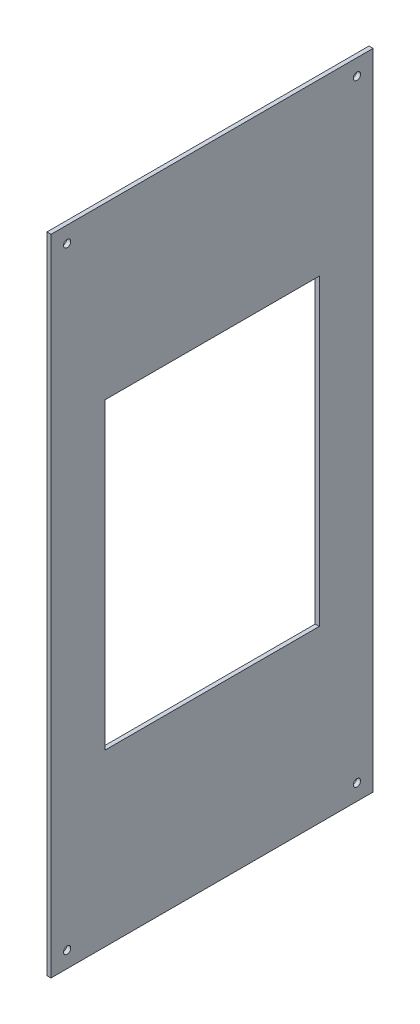
ISO-10303-21;
HEADER;
FILE_DESCRIPTION(('STEP AP214'),'2;1');
FILE_NAME('part.step','',(''),(''),'','','');
FILE_SCHEMA(('AUTOMOTIVE_DESIGN { 1 0 10303 214 1 1 1 1 }'));
ENDSEC;
DATA;
#1=APPLICATION_CONTEXT('core data for automotive mechanical design processes');
#2=APPLICATION_PROTOCOL_DEFINITION('international standard','automotive_design',2000,#1);
#3=PRODUCT_CONTEXT('',#1,'mechanical');
#4=PRODUCT('Part','Part','',(#3));
#5=PRODUCT_RELATED_PRODUCT_CATEGORY('part','',(#4));
#6=PRODUCT_DEFINITION_FORMATION('','',#4);
#7=PRODUCT_DEFINITION_CONTEXT('part definition',#1,'design');
#8=PRODUCT_DEFINITION('design','',#6,#7);
#9=PRODUCT_DEFINITION_SHAPE('','',#8);
#10=(LENGTH_UNIT() NAMED_UNIT(*) SI_UNIT(.MILLI.,.METRE.));
#11=(NAMED_UNIT(*) PLANE_ANGLE_UNIT() SI_UNIT($,.RADIAN.));
#12=(NAMED_UNIT(*) SI_UNIT($,.STERADIAN.) SOLID_ANGLE_UNIT());
#13=UNCERTAINTY_MEASURE_WITH_UNIT(LENGTH_MEASURE(1.E-05),#10,'distance_accuracy_value','');
#14=(GEOMETRIC_REPRESENTATION_CONTEXT(3) GLOBAL_UNCERTAINTY_ASSIGNED_CONTEXT((#13)) GLOBAL_UNIT_ASSIGNED_CONTEXT((#10,
#11,#12)) REPRESENTATION_CONTEXT('',''));
#15=CARTESIAN_POINT('',(0.,0.,0.));
#16=DIRECTION('',(0.,0.,1.));
#17=DIRECTION('',(1.,0.,0.));
#18=AXIS2_PLACEMENT_3D('',#15,#16,#17);
#19=CARTESIAN_POINT('',(3.175,0.,0.));
#20=DIRECTION('',(-1.,0.,0.));
#21=DIRECTION('',(0.,0.,1.));
#22=AXIS2_PLACEMENT_3D('',#19,#20,#21);
#23=PLANE('',#22);
#24=DIRECTION('',(0.,1.,0.));
#25=VECTOR('',#24,1.);
#26=CARTESIAN_POINT('',(3.175,117.75,-83.25));
#27=LINE('',#26,#25);
#28=CARTESIAN_POINT('',(3.175,-117.75,-83.25));
#29=VERTEX_POINT('',#28);
#30=CARTESIAN_POINT('',(3.175,117.75,-83.25));
#31=VERTEX_POINT('',#30);
#32=EDGE_CURVE('E144',#29,#31,#27,.T.);
#33=ORIENTED_EDGE('',*,*,#32,.F.);
#34=DIRECTION('',(0.,0.,-1.));
#35=VECTOR('',#34,1.);
#36=CARTESIAN_POINT('',(3.175,-117.75,-83.25));
#37=LINE('',#36,#35);
#38=CARTESIAN_POINT('',(3.175,-117.75,83.25));
#39=VERTEX_POINT('',#38);
#40=EDGE_CURVE('E60',#39,#29,#37,.T.);
#41=ORIENTED_EDGE('',*,*,#40,.F.);
#42=DIRECTION('',(0.,-1.,0.));
#43=VECTOR('',#42,1.);
#44=CARTESIAN_POINT('',(3.175,117.75,83.25));
#45=LINE('',#44,#43);
#46=CARTESIAN_POINT('',(3.175,117.75,83.25));
#47=VERTEX_POINT('',#46);
#48=EDGE_CURVE('E131',#47,#39,#45,.T.);
#49=ORIENTED_EDGE('',*,*,#48,.F.);
#50=DIRECTION('',(0.,0.,1.));
#51=VECTOR('',#50,1.);
#52=CARTESIAN_POINT('',(3.175,117.75,-83.25));
#53=LINE('',#52,#51);
#54=EDGE_CURVE('E135',#31,#47,#53,.T.);
#55=ORIENTED_EDGE('',*,*,#54,.F.);
#56=EDGE_LOOP('',(#33,#41,#49,#55));
#57=FACE_BOUND('',#56,.T.);
#58=DIRECTION('',(0.,0.,1.));
#59=VECTOR('',#58,1.);
#60=CARTESIAN_POINT('',(3.175,250.,-125.));
#61=LINE('',#60,#59);
#62=CARTESIAN_POINT('',(3.175,250.,-125.));
#63=VERTEX_POINT('',#62);
#64=CARTESIAN_POINT('',(3.175,250.,125.));
#65=VERTEX_POINT('',#64);
#66=EDGE_CURVE('E191',#63,#65,#61,.T.);
#67=ORIENTED_EDGE('',*,*,#66,.T.);
#68=DIRECTION('',(0.,-1.,0.));
#69=VECTOR('',#68,1.);
#70=CARTESIAN_POINT('',(3.175,-250.,125.));
#71=LINE('',#70,#69);
#72=CARTESIAN_POINT('',(3.175,-250.,125.));
#73=VERTEX_POINT('',#72);
#74=EDGE_CURVE('E195',#65,#73,#71,.T.);
#75=ORIENTED_EDGE('',*,*,#74,.T.);
#76=DIRECTION('',(0.,0.,-1.));
#77=VECTOR('',#76,1.);
#78=CARTESIAN_POINT('',(3.175,-250.,-125.));
#79=LINE('',#78,#77);
#80=CARTESIAN_POINT('',(3.175,-250.,-125.));
#81=VERTEX_POINT('',#80);
#82=EDGE_CURVE('E199',#73,#81,#79,.T.);
#83=ORIENTED_EDGE('',*,*,#82,.T.);
#84=DIRECTION('',(0.,1.,0.));
#85=VECTOR('',#84,1.);
#86=CARTESIAN_POINT('',(3.175,-250.,-125.));
#87=LINE('',#86,#85);
#88=EDGE_CURVE('E202',#81,#63,#87,.T.);
#89=ORIENTED_EDGE('',*,*,#88,.T.);
#90=EDGE_LOOP('',(#67,#75,#83,#89));
#91=FACE_BOUND('',#90,.T.);
#92=CARTESIAN_POINT('',(3.175,-237.5,112.5));
#93=DIRECTION('',(1.,0.,0.));
#94=DIRECTION('',(0.,0.,-1.));
#95=AXIS2_PLACEMENT_3D('',#92,#93,#94);
#96=CIRCLE('',#95,2.8);
#97=CARTESIAN_POINT('',(3.175,-237.5,109.7));
#98=VERTEX_POINT('',#97);
#99=EDGE_CURVE('E183',#98,#98,#96,.T.);
#100=ORIENTED_EDGE('',*,*,#99,.F.);
#101=EDGE_LOOP('',(#100));
#102=FACE_BOUND('',#101,.T.);
#103=CARTESIAN_POINT('',(3.175,237.5,112.5));
#104=DIRECTION('',(1.,0.,0.));
#105=DIRECTION('',(0.,0.,1.));
#106=AXIS2_PLACEMENT_3D('',#103,#104,#105);
#107=CIRCLE('',#106,2.8);
#108=CARTESIAN_POINT('',(3.175,237.5,115.3));
#109=VERTEX_POINT('',#108);
#110=EDGE_CURVE('E175',#109,#109,#107,.T.);
#111=ORIENTED_EDGE('',*,*,#110,.F.);
#112=EDGE_LOOP('',(#111));
#113=FACE_BOUND('',#112,.T.);
#114=CARTESIAN_POINT('',(3.175,237.5,-112.5));
#115=DIRECTION('',(1.,0.,0.));
#116=DIRECTION('',(0.,0.,-1.));
#117=AXIS2_PLACEMENT_3D('',#114,#115,#116);
#118=CIRCLE('',#117,2.8);
#119=CARTESIAN_POINT('',(3.175,237.5,-115.3));
#120=VERTEX_POINT('',#119);
#121=EDGE_CURVE('E167',#120,#120,#118,.T.);
#122=ORIENTED_EDGE('',*,*,#121,.F.);
#123=EDGE_LOOP('',(#122));
#124=FACE_BOUND('',#123,.T.);
#125=CARTESIAN_POINT('',(3.175,-237.5,-112.5));
#126=DIRECTION('',(1.,0.,0.));
#127=DIRECTION('',(0.,0.,1.));
#128=AXIS2_PLACEMENT_3D('',#125,#126,#127);
#129=CIRCLE('',#128,2.8);
#130=CARTESIAN_POINT('',(3.175,-237.5,-109.7));
#131=VERTEX_POINT('',#130);
#132=EDGE_CURVE('E159',#131,#131,#129,.T.);
#133=ORIENTED_EDGE('',*,*,#132,.F.);
#134=EDGE_LOOP('',(#133));
#135=FACE_BOUND('',#134,.T.);
#136=ADVANCED_FACE('F44',(#57,#91,#102,#113,#124,#135),#23,.F.);
#137=CARTESIAN_POINT('',(0.,0.,0.));
#138=DIRECTION('',(-1.,0.,0.));
#139=DIRECTION('',(0.,0.,1.));
#140=AXIS2_PLACEMENT_3D('',#137,#138,#139);
#141=PLANE('',#140);
#142=DIRECTION('',(0.,0.,-1.));
#143=VECTOR('',#142,1.);
#144=CARTESIAN_POINT('',(0.,-117.75,-83.25));
#145=LINE('',#144,#143);
#146=CARTESIAN_POINT('',(0.,-117.75,83.25));
#147=VERTEX_POINT('',#146);
#148=CARTESIAN_POINT('',(0.,-117.75,-83.25));
#149=VERTEX_POINT('',#148);
#150=EDGE_CURVE('E112',#147,#149,#145,.T.);
#151=ORIENTED_EDGE('',*,*,#150,.T.);
#152=DIRECTION('',(0.,1.,0.));
#153=VECTOR('',#152,1.);
#154=CARTESIAN_POINT('',(0.,117.75,-83.25));
#155=LINE('',#154,#153);
#156=CARTESIAN_POINT('',(0.,117.75,-83.25));
#157=VERTEX_POINT('',#156);
#158=EDGE_CURVE('E122',#149,#157,#155,.T.);
#159=ORIENTED_EDGE('',*,*,#158,.T.);
#160=DIRECTION('',(0.,0.,1.));
#161=VECTOR('',#160,1.);
#162=CARTESIAN_POINT('',(0.,117.75,-83.25));
#163=LINE('',#162,#161);
#164=CARTESIAN_POINT('',(0.,117.75,83.25));
#165=VERTEX_POINT('',#164);
#166=EDGE_CURVE('E68',#157,#165,#163,.T.);
#167=ORIENTED_EDGE('',*,*,#166,.T.);
#168=DIRECTION('',(0.,-1.,0.));
#169=VECTOR('',#168,1.);
#170=CARTESIAN_POINT('',(0.,117.75,83.25));
#171=LINE('',#170,#169);
#172=EDGE_CURVE('E119',#165,#147,#171,.T.);
#173=ORIENTED_EDGE('',*,*,#172,.T.);
#174=EDGE_LOOP('',(#151,#159,#167,#173));
#175=FACE_BOUND('',#174,.T.);
#176=CARTESIAN_POINT('',(0.,237.5,-112.5));
#177=DIRECTION('',(1.,0.,0.));
#178=DIRECTION('',(0.,0.,-1.));
#179=AXIS2_PLACEMENT_3D('',#176,#177,#178);
#180=CIRCLE('',#179,2.8);
#181=CARTESIAN_POINT('',(0.,237.5,-115.3));
#182=VERTEX_POINT('',#181);
#183=EDGE_CURVE('E163',#182,#182,#180,.T.);
#184=ORIENTED_EDGE('',*,*,#183,.T.);
#185=EDGE_LOOP('',(#184));
#186=FACE_BOUND('',#185,.T.);
#187=CARTESIAN_POINT('',(0.,-237.5,112.5));
#188=DIRECTION('',(1.,0.,0.));
#189=DIRECTION('',(0.,0.,-1.));
#190=AXIS2_PLACEMENT_3D('',#187,#188,#189);
#191=CIRCLE('',#190,2.8);
#192=CARTESIAN_POINT('',(0.,-237.5,109.7));
#193=VERTEX_POINT('',#192);
#194=EDGE_CURVE('E179',#193,#193,#191,.T.);
#195=ORIENTED_EDGE('',*,*,#194,.T.);
#196=EDGE_LOOP('',(#195));
#197=FACE_BOUND('',#196,.T.);
#198=DIRECTION('',(0.,0.,1.));
#199=VECTOR('',#198,1.);
#200=CARTESIAN_POINT('',(0.,250.,-125.));
#201=LINE('',#200,#199);
#202=CARTESIAN_POINT('',(0.,250.,-125.));
#203=VERTEX_POINT('',#202);
#204=CARTESIAN_POINT('',(0.,250.,125.));
#205=VERTEX_POINT('',#204);
#206=EDGE_CURVE('E187',#203,#205,#201,.T.);
#207=ORIENTED_EDGE('',*,*,#206,.F.);
#208=DIRECTION('',(0.,1.,0.));
#209=VECTOR('',#208,1.);
#210=CARTESIAN_POINT('',(0.,-250.,-125.));
#211=LINE('',#210,#209);
#212=CARTESIAN_POINT('',(0.,-250.,-125.));
#213=VERTEX_POINT('',#212);
#214=EDGE_CURVE('E196',#213,#203,#211,.T.);
#215=ORIENTED_EDGE('',*,*,#214,.F.);
#216=DIRECTION('',(0.,0.,-1.));
#217=VECTOR('',#216,1.);
#218=CARTESIAN_POINT('',(0.,-250.,-125.));
#219=LINE('',#218,#217);
#220=CARTESIAN_POINT('',(0.,-250.,125.));
#221=VERTEX_POINT('',#220);
#222=EDGE_CURVE('E212',#221,#213,#219,.T.);
#223=ORIENTED_EDGE('',*,*,#222,.F.);
#224=DIRECTION('',(0.,-1.,0.));
#225=VECTOR('',#224,1.);
#226=CARTESIAN_POINT('',(0.,-250.,125.));
#227=LINE('',#226,#225);
#228=EDGE_CURVE('E209',#205,#221,#227,.T.);
#229=ORIENTED_EDGE('',*,*,#228,.F.);
#230=EDGE_LOOP('',(#207,#215,#223,#229));
#231=FACE_BOUND('',#230,.T.);
#232=CARTESIAN_POINT('',(0.,237.5,112.5));
#233=DIRECTION('',(1.,0.,0.));
#234=DIRECTION('',(0.,0.,1.));
#235=AXIS2_PLACEMENT_3D('',#232,#233,#234);
#236=CIRCLE('',#235,2.8);
#237=CARTESIAN_POINT('',(0.,237.5,115.3));
#238=VERTEX_POINT('',#237);
#239=EDGE_CURVE('E171',#238,#238,#236,.T.);
#240=ORIENTED_EDGE('',*,*,#239,.T.);
#241=EDGE_LOOP('',(#240));
#242=FACE_BOUND('',#241,.T.);
#243=CARTESIAN_POINT('',(0.,-237.5,-112.5));
#244=DIRECTION('',(1.,0.,0.));
#245=DIRECTION('',(0.,0.,1.));
#246=AXIS2_PLACEMENT_3D('',#243,#244,#245);
#247=CIRCLE('',#246,2.8);
#248=CARTESIAN_POINT('',(0.,-237.5,-109.7));
#249=VERTEX_POINT('',#248);
#250=EDGE_CURVE('E153',#249,#249,#247,.T.);
#251=ORIENTED_EDGE('',*,*,#250,.T.);
#252=EDGE_LOOP('',(#251));
#253=FACE_BOUND('',#252,.T.);
#254=ADVANCED_FACE('F127',(#175,#186,#197,#231,#242,#253),#141,.T.);
#255=CARTESIAN_POINT('',(3.175,250.,-125.));
#256=DIRECTION('',(0.,-1.,0.));
#257=DIRECTION('',(0.,0.,-1.));
#258=AXIS2_PLACEMENT_3D('',#255,#256,#257);
#259=PLANE('',#258);
#260=ORIENTED_EDGE('',*,*,#206,.T.);
#261=DIRECTION('',(-1.,0.,0.));
#262=VECTOR('',#261,1.);
#263=CARTESIAN_POINT('',(3.175,250.,125.));
#264=LINE('',#263,#262);
#265=EDGE_CURVE('E11',#65,#205,#264,.T.);
#266=ORIENTED_EDGE('',*,*,#265,.F.);
#267=ORIENTED_EDGE('',*,*,#66,.F.);
#268=DIRECTION('',(-1.,0.,0.));
#269=VECTOR('',#268,1.);
#270=CARTESIAN_POINT('',(3.175,250.,-125.));
#271=LINE('',#270,#269);
#272=EDGE_CURVE('E205',#63,#203,#271,.T.);
#273=ORIENTED_EDGE('',*,*,#272,.T.);
#274=EDGE_LOOP('',(#260,#266,#267,#273));
#275=FACE_BOUND('',#274,.T.);
#276=ADVANCED_FACE('F46',(#275),#259,.F.);
#277=CARTESIAN_POINT('',(3.175,-250.,125.));
#278=DIRECTION('',(0.,0.,-1.));
#279=DIRECTION('',(-1.,0.,0.));
#280=AXIS2_PLACEMENT_3D('',#277,#278,#279);
#281=PLANE('',#280);
#282=ORIENTED_EDGE('',*,*,#228,.T.);
#283=DIRECTION('',(-1.,0.,0.));
#284=VECTOR('',#283,1.);
#285=CARTESIAN_POINT('',(3.175,-250.,125.));
#286=LINE('',#285,#284);
#287=EDGE_CURVE('E53',#73,#221,#286,.T.);
#288=ORIENTED_EDGE('',*,*,#287,.F.);
#289=ORIENTED_EDGE('',*,*,#74,.F.);
#290=ORIENTED_EDGE('',*,*,#265,.T.);
#291=EDGE_LOOP('',(#282,#288,#289,#290));
#292=FACE_BOUND('',#291,.T.);
#293=ADVANCED_FACE('F245',(#292),#281,.F.);
#294=CARTESIAN_POINT('',(3.175,-250.,-125.));
#295=DIRECTION('',(0.,1.,0.));
#296=DIRECTION('',(0.,0.,1.));
#297=AXIS2_PLACEMENT_3D('',#294,#295,#296);
#298=PLANE('',#297);
#299=ORIENTED_EDGE('',*,*,#222,.T.);
#300=DIRECTION('',(-1.,0.,0.));
#301=VECTOR('',#300,1.);
#302=CARTESIAN_POINT('',(3.175,-250.,-125.));
#303=LINE('',#302,#301);
#304=EDGE_CURVE('E220',#81,#213,#303,.T.);
#305=ORIENTED_EDGE('',*,*,#304,.F.);
#306=ORIENTED_EDGE('',*,*,#82,.F.);
#307=ORIENTED_EDGE('',*,*,#287,.T.);
#308=EDGE_LOOP('',(#299,#305,#306,#307));
#309=FACE_BOUND('',#308,.T.);
#310=ADVANCED_FACE('F229',(#309),#298,.F.);
#311=CARTESIAN_POINT('',(3.175,-250.,-125.));
#312=DIRECTION('',(0.,0.,1.));
#313=DIRECTION('',(1.,0.,0.));
#314=AXIS2_PLACEMENT_3D('',#311,#312,#313);
#315=PLANE('',#314);
#316=ORIENTED_EDGE('',*,*,#214,.T.);
#317=ORIENTED_EDGE('',*,*,#272,.F.);
#318=ORIENTED_EDGE('',*,*,#88,.F.);
#319=ORIENTED_EDGE('',*,*,#304,.T.);
#320=EDGE_LOOP('',(#316,#317,#318,#319));
#321=FACE_BOUND('',#320,.T.);
#322=ADVANCED_FACE('F238',(#321),#315,.F.);
#323=CARTESIAN_POINT('',(3.175,-237.5,112.5));
#324=DIRECTION('',(-1.,0.,0.));
#325=DIRECTION('',(0.,0.,1.));
#326=AXIS2_PLACEMENT_3D('',#323,#324,#325);
#327=CYLINDRICAL_SURFACE('',#326,2.8);
#328=ORIENTED_EDGE('',*,*,#99,.T.);
#329=EDGE_LOOP('',(#328));
#330=FACE_BOUND('',#329,.T.);
#331=ORIENTED_EDGE('',*,*,#194,.F.);
#332=EDGE_LOOP('',(#331));
#333=FACE_BOUND('',#332,.T.);
#334=ADVANCED_FACE('F261',(#330,#333),#327,.F.);
#335=CARTESIAN_POINT('',(3.175,237.5,112.5));
#336=DIRECTION('',(-1.,0.,0.));
#337=DIRECTION('',(0.,0.,1.));
#338=AXIS2_PLACEMENT_3D('',#335,#336,#337);
#339=CYLINDRICAL_SURFACE('',#338,2.8);
#340=ORIENTED_EDGE('',*,*,#110,.T.);
#341=EDGE_LOOP('',(#340));
#342=FACE_BOUND('',#341,.T.);
#343=ORIENTED_EDGE('',*,*,#239,.F.);
#344=EDGE_LOOP('',(#343));
#345=FACE_BOUND('',#344,.T.);
#346=ADVANCED_FACE('F268',(#342,#345),#339,.F.);
#347=CARTESIAN_POINT('',(3.175,237.5,-112.5));
#348=DIRECTION('',(-1.,0.,0.));
#349=DIRECTION('',(0.,0.,1.));
#350=AXIS2_PLACEMENT_3D('',#347,#348,#349);
#351=CYLINDRICAL_SURFACE('',#350,2.8);
#352=ORIENTED_EDGE('',*,*,#121,.T.);
#353=EDGE_LOOP('',(#352));
#354=FACE_BOUND('',#353,.T.);
#355=ORIENTED_EDGE('',*,*,#183,.F.);
#356=EDGE_LOOP('',(#355));
#357=FACE_BOUND('',#356,.T.);
#358=ADVANCED_FACE('F273',(#354,#357),#351,.F.);
#359=CARTESIAN_POINT('',(3.175,-237.5,-112.5));
#360=DIRECTION('',(-1.,0.,0.));
#361=DIRECTION('',(0.,0.,1.));
#362=AXIS2_PLACEMENT_3D('',#359,#360,#361);
#363=CYLINDRICAL_SURFACE('',#362,2.8);
#364=ORIENTED_EDGE('',*,*,#132,.T.);
#365=EDGE_LOOP('',(#364));
#366=FACE_BOUND('',#365,.T.);
#367=ORIENTED_EDGE('',*,*,#250,.F.);
#368=EDGE_LOOP('',(#367));
#369=FACE_BOUND('',#368,.T.);
#370=ADVANCED_FACE('F286',(#366,#369),#363,.F.);
#371=CARTESIAN_POINT('',(0.,-117.75,-83.25));
#372=DIRECTION('',(0.,-1.,0.));
#373=DIRECTION('',(0.,0.,-1.));
#374=AXIS2_PLACEMENT_3D('',#371,#372,#373);
#375=PLANE('',#374);
#376=ORIENTED_EDGE('',*,*,#40,.T.);
#377=DIRECTION('',(1.,0.,0.));
#378=VECTOR('',#377,1.);
#379=CARTESIAN_POINT('',(0.,-117.75,-83.25));
#380=LINE('',#379,#378);
#381=EDGE_CURVE('E108',#149,#29,#380,.T.);
#382=ORIENTED_EDGE('',*,*,#381,.F.);
#383=ORIENTED_EDGE('',*,*,#150,.F.);
#384=DIRECTION('',(1.,0.,0.));
#385=VECTOR('',#384,1.);
#386=CARTESIAN_POINT('',(0.,-117.75,83.25));
#387=LINE('',#386,#385);
#388=EDGE_CURVE('E150',#147,#39,#387,.T.);
#389=ORIENTED_EDGE('',*,*,#388,.T.);
#390=EDGE_LOOP('',(#376,#382,#383,#389));
#391=FACE_BOUND('',#390,.T.);
#392=ADVANCED_FACE('F110',(#391),#375,.F.);
#393=CARTESIAN_POINT('',(0.,117.75,83.25));
#394=DIRECTION('',(0.,0.,1.));
#395=DIRECTION('',(0.,-1.,0.));
#396=AXIS2_PLACEMENT_3D('',#393,#394,#395);
#397=PLANE('',#396);
#398=ORIENTED_EDGE('',*,*,#48,.T.);
#399=ORIENTED_EDGE('',*,*,#388,.F.);
#400=ORIENTED_EDGE('',*,*,#172,.F.);
#401=DIRECTION('',(1.,0.,0.));
#402=VECTOR('',#401,1.);
#403=CARTESIAN_POINT('',(0.,117.75,83.25));
#404=LINE('',#403,#402);
#405=EDGE_CURVE('E154',#165,#47,#404,.T.);
#406=ORIENTED_EDGE('',*,*,#405,.T.);
#407=EDGE_LOOP('',(#398,#399,#400,#406));
#408=FACE_BOUND('',#407,.T.);
#409=ADVANCED_FACE('F295',(#408),#397,.F.);
#410=CARTESIAN_POINT('',(0.,117.75,-83.25));
#411=DIRECTION('',(0.,1.,0.));
#412=DIRECTION('',(0.,0.,1.));
#413=AXIS2_PLACEMENT_3D('',#410,#411,#412);
#414=PLANE('',#413);
#415=ORIENTED_EDGE('',*,*,#54,.T.);
#416=ORIENTED_EDGE('',*,*,#405,.F.);
#417=ORIENTED_EDGE('',*,*,#166,.F.);
#418=DIRECTION('',(1.,0.,0.));
#419=VECTOR('',#418,1.);
#420=CARTESIAN_POINT('',(0.,117.75,-83.25));
#421=LINE('',#420,#419);
#422=EDGE_CURVE('E118',#157,#31,#421,.T.);
#423=ORIENTED_EDGE('',*,*,#422,.T.);
#424=EDGE_LOOP('',(#415,#416,#417,#423));
#425=FACE_BOUND('',#424,.T.);
#426=ADVANCED_FACE('F302',(#425),#414,.F.);
#427=CARTESIAN_POINT('',(0.,117.75,-83.25));
#428=DIRECTION('',(0.,0.,-1.));
#429=DIRECTION('',(0.,1.,0.));
#430=AXIS2_PLACEMENT_3D('',#427,#428,#429);
#431=PLANE('',#430);
#432=ORIENTED_EDGE('',*,*,#32,.T.);
#433=ORIENTED_EDGE('',*,*,#422,.F.);
#434=ORIENTED_EDGE('',*,*,#158,.F.);
#435=ORIENTED_EDGE('',*,*,#381,.T.);
#436=EDGE_LOOP('',(#432,#433,#434,#435));
#437=FACE_BOUND('',#436,.T.);
#438=ADVANCED_FACE('F123',(#437),#431,.F.);
#439=CLOSED_SHELL('',(#136,#254,#276,#293,#310,#322,#334,#346,#358,#370,#392,#409,#426,#438));
#440=MANIFOLD_SOLID_BREP('B2',#439);
#441=ADVANCED_BREP_SHAPE_REPRESENTATION('',(#18,#440),#14);
#442=SHAPE_DEFINITION_REPRESENTATION(#9,#441);
ENDSEC;
END-ISO-10303-21;
